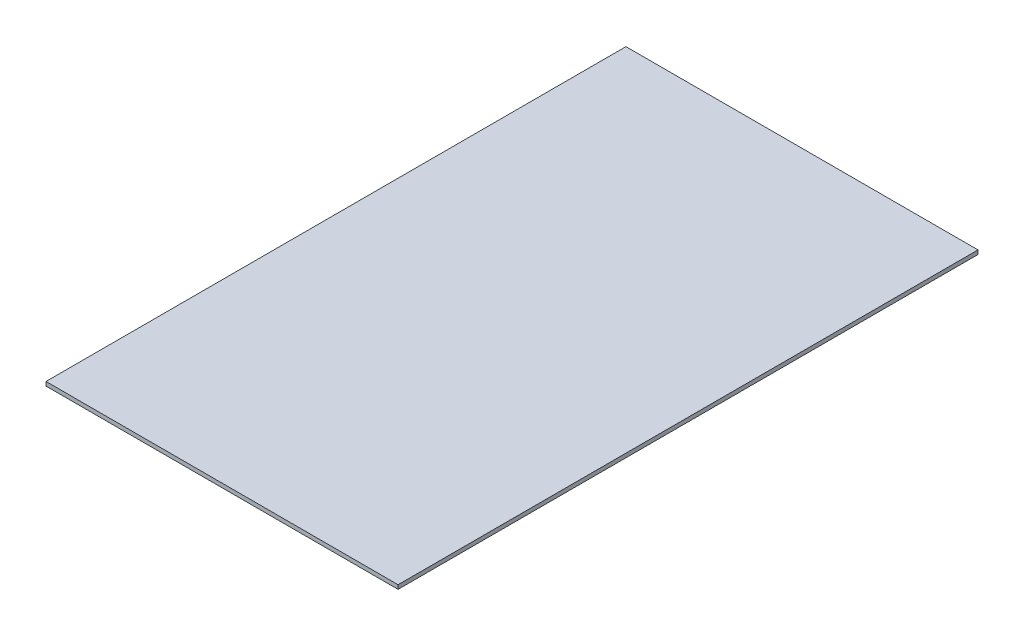
ISO-10303-21;
HEADER;
FILE_DESCRIPTION(('STEP AP214'),'2;1');
FILE_NAME('part.step','',(''),(''),'','','');
FILE_SCHEMA(('AUTOMOTIVE_DESIGN { 1 0 10303 214 1 1 1 1 }'));
ENDSEC;
DATA;
#1=APPLICATION_CONTEXT('core data for automotive mechanical design processes');
#2=APPLICATION_PROTOCOL_DEFINITION('international standard','automotive_design',2000,#1);
#3=PRODUCT_CONTEXT('',#1,'mechanical');
#4=PRODUCT('Part','Part','',(#3));
#5=PRODUCT_RELATED_PRODUCT_CATEGORY('part','',(#4));
#6=PRODUCT_DEFINITION_FORMATION('','',#4);
#7=PRODUCT_DEFINITION_CONTEXT('part definition',#1,'design');
#8=PRODUCT_DEFINITION('design','',#6,#7);
#9=PRODUCT_DEFINITION_SHAPE('','',#8);
#10=(LENGTH_UNIT() NAMED_UNIT(*) SI_UNIT(.MILLI.,.METRE.));
#11=(NAMED_UNIT(*) PLANE_ANGLE_UNIT() SI_UNIT($,.RADIAN.));
#12=(NAMED_UNIT(*) SI_UNIT($,.STERADIAN.) SOLID_ANGLE_UNIT());
#13=UNCERTAINTY_MEASURE_WITH_UNIT(LENGTH_MEASURE(1.E-05),#10,'distance_accuracy_value','');
#14=(GEOMETRIC_REPRESENTATION_CONTEXT(3) GLOBAL_UNCERTAINTY_ASSIGNED_CONTEXT((#13)) GLOBAL_UNIT_ASSIGNED_CONTEXT((#10,
#11,#12)) REPRESENTATION_CONTEXT('',''));
#15=CARTESIAN_POINT('',(0.,0.,0.));
#16=DIRECTION('',(0.,0.,1.));
#17=DIRECTION('',(1.,0.,0.));
#18=AXIS2_PLACEMENT_3D('',#15,#16,#17);
#19=CARTESIAN_POINT('',(-138.77671,1.5875,457.2));
#20=DIRECTION('',(1.,0.,0.));
#21=DIRECTION('',(0.,0.,-1.));
#22=AXIS2_PLACEMENT_3D('',#19,#20,#21);
#23=PLANE('',#22);
#24=DIRECTION('',(0.,-1.,0.));
#25=VECTOR('',#24,1.);
#26=CARTESIAN_POINT('',(-138.77671,1.5875,0.));
#27=LINE('',#26,#25);
#28=CARTESIAN_POINT('',(-138.77671,1.5875,0.));
#29=VERTEX_POINT('',#28);
#30=CARTESIAN_POINT('',(-138.77671,-1.5875,0.));
#31=VERTEX_POINT('',#30);
#32=EDGE_CURVE('E96',#29,#31,#27,.T.);
#33=ORIENTED_EDGE('',*,*,#32,.T.);
#34=DIRECTION('',(0.,0.,-1.));
#35=VECTOR('',#34,1.);
#36=CARTESIAN_POINT('',(-138.77671,-1.5875,457.2));
#37=LINE('',#36,#35);
#38=CARTESIAN_POINT('',(-138.77671,-1.5875,457.2));
#39=VERTEX_POINT('',#38);
#40=EDGE_CURVE('E11',#39,#31,#37,.T.);
#41=ORIENTED_EDGE('',*,*,#40,.F.);
#42=DIRECTION('',(0.,-1.,0.));
#43=VECTOR('',#42,1.);
#44=CARTESIAN_POINT('',(-138.77671,1.5875,457.2));
#45=LINE('',#44,#43);
#46=CARTESIAN_POINT('',(-138.77671,1.5875,457.2));
#47=VERTEX_POINT('',#46);
#48=EDGE_CURVE('E82',#47,#39,#45,.T.);
#49=ORIENTED_EDGE('',*,*,#48,.F.);
#50=DIRECTION('',(0.,0.,-1.));
#51=VECTOR('',#50,1.);
#52=CARTESIAN_POINT('',(-138.77671,1.5875,457.2));
#53=LINE('',#52,#51);
#54=EDGE_CURVE('E49',#47,#29,#53,.T.);
#55=ORIENTED_EDGE('',*,*,#54,.T.);
#56=EDGE_LOOP('',(#33,#41,#49,#55));
#57=FACE_BOUND('',#56,.T.);
#58=ADVANCED_FACE('F33',(#57),#23,.F.);
#59=CARTESIAN_POINT('',(-138.77671,-1.5875,457.2));
#60=DIRECTION('',(0.,1.,0.));
#61=DIRECTION('',(0.,0.,1.));
#62=AXIS2_PLACEMENT_3D('',#59,#60,#61);
#63=PLANE('',#62);
#64=DIRECTION('',(1.,0.,0.));
#65=VECTOR('',#64,1.);
#66=CARTESIAN_POINT('',(-138.77671,-1.5875,0.));
#67=LINE('',#66,#65);
#68=CARTESIAN_POINT('',(138.77671,-1.5875,0.));
#69=VERTEX_POINT('',#68);
#70=EDGE_CURVE('E87',#31,#69,#67,.T.);
#71=ORIENTED_EDGE('',*,*,#70,.T.);
#72=DIRECTION('',(0.,0.,-1.));
#73=VECTOR('',#72,1.);
#74=CARTESIAN_POINT('',(138.77671,-1.5875,457.2));
#75=LINE('',#74,#73);
#76=CARTESIAN_POINT('',(138.77671,-1.5875,457.2));
#77=VERTEX_POINT('',#76);
#78=EDGE_CURVE('E41',#77,#69,#75,.T.);
#79=ORIENTED_EDGE('',*,*,#78,.F.);
#80=DIRECTION('',(1.,0.,0.));
#81=VECTOR('',#80,1.);
#82=CARTESIAN_POINT('',(-138.77671,-1.5875,457.2));
#83=LINE('',#82,#81);
#84=EDGE_CURVE('E74',#39,#77,#83,.T.);
#85=ORIENTED_EDGE('',*,*,#84,.F.);
#86=ORIENTED_EDGE('',*,*,#40,.T.);
#87=EDGE_LOOP('',(#71,#79,#85,#86));
#88=FACE_BOUND('',#87,.T.);
#89=ADVANCED_FACE('F86',(#88),#63,.F.);
#90=CARTESIAN_POINT('',(138.77671,1.5875,457.2));
#91=DIRECTION('',(1.,0.,0.));
#92=DIRECTION('',(0.,0.,-1.));
#93=AXIS2_PLACEMENT_3D('',#90,#91,#92);
#94=PLANE('',#93);
#95=DIRECTION('',(0.,-1.,0.));
#96=VECTOR('',#95,1.);
#97=CARTESIAN_POINT('',(138.77671,1.5875,0.));
#98=LINE('',#97,#96);
#99=CARTESIAN_POINT('',(138.77671,1.5875,0.));
#100=VERTEX_POINT('',#99);
#101=EDGE_CURVE('E99',#100,#69,#98,.T.);
#102=ORIENTED_EDGE('',*,*,#101,.F.);
#103=DIRECTION('',(0.,0.,-1.));
#104=VECTOR('',#103,1.);
#105=CARTESIAN_POINT('',(138.77671,1.5875,457.2));
#106=LINE('',#105,#104);
#107=CARTESIAN_POINT('',(138.77671,1.5875,457.2));
#108=VERTEX_POINT('',#107);
#109=EDGE_CURVE('E63',#108,#100,#106,.T.);
#110=ORIENTED_EDGE('',*,*,#109,.F.);
#111=DIRECTION('',(0.,-1.,0.));
#112=VECTOR('',#111,1.);
#113=CARTESIAN_POINT('',(138.77671,1.5875,457.2));
#114=LINE('',#113,#112);
#115=EDGE_CURVE('E81',#108,#77,#114,.T.);
#116=ORIENTED_EDGE('',*,*,#115,.T.);
#117=ORIENTED_EDGE('',*,*,#78,.T.);
#118=EDGE_LOOP('',(#102,#110,#116,#117));
#119=FACE_BOUND('',#118,.T.);
#120=ADVANCED_FACE('F90',(#119),#94,.T.);
#121=CARTESIAN_POINT('',(-138.77671,1.5875,457.2));
#122=DIRECTION('',(0.,1.,0.));
#123=DIRECTION('',(0.,0.,1.));
#124=AXIS2_PLACEMENT_3D('',#121,#122,#123);
#125=PLANE('',#124);
#126=DIRECTION('',(1.,0.,0.));
#127=VECTOR('',#126,1.);
#128=CARTESIAN_POINT('',(-138.77671,1.5875,0.));
#129=LINE('',#128,#127);
#130=EDGE_CURVE('E101',#29,#100,#129,.T.);
#131=ORIENTED_EDGE('',*,*,#130,.F.);
#132=ORIENTED_EDGE('',*,*,#54,.F.);
#133=DIRECTION('',(1.,0.,0.));
#134=VECTOR('',#133,1.);
#135=CARTESIAN_POINT('',(-138.77671,1.5875,457.2));
#136=LINE('',#135,#134);
#137=EDGE_CURVE('E91',#47,#108,#136,.T.);
#138=ORIENTED_EDGE('',*,*,#137,.T.);
#139=ORIENTED_EDGE('',*,*,#109,.T.);
#140=EDGE_LOOP('',(#131,#132,#138,#139));
#141=FACE_BOUND('',#140,.T.);
#142=ADVANCED_FACE('F107',(#141),#125,.T.);
#143=CARTESIAN_POINT('',(0.,0.,457.2));
#144=DIRECTION('',(0.,0.,1.));
#145=DIRECTION('',(1.,0.,0.));
#146=AXIS2_PLACEMENT_3D('',#143,#144,#145);
#147=PLANE('',#146);
#148=ORIENTED_EDGE('',*,*,#48,.T.);
#149=ORIENTED_EDGE('',*,*,#84,.T.);
#150=ORIENTED_EDGE('',*,*,#115,.F.);
#151=ORIENTED_EDGE('',*,*,#137,.F.);
#152=EDGE_LOOP('',(#148,#149,#150,#151));
#153=FACE_BOUND('',#152,.T.);
#154=ADVANCED_FACE('F78',(#153),#147,.T.);
#155=CARTESIAN_POINT('',(0.,0.,0.));
#156=DIRECTION('',(0.,0.,1.));
#157=DIRECTION('',(1.,0.,0.));
#158=AXIS2_PLACEMENT_3D('',#155,#156,#157);
#159=PLANE('',#158);
#160=ORIENTED_EDGE('',*,*,#32,.F.);
#161=ORIENTED_EDGE('',*,*,#130,.T.);
#162=ORIENTED_EDGE('',*,*,#101,.T.);
#163=ORIENTED_EDGE('',*,*,#70,.F.);
#164=EDGE_LOOP('',(#160,#161,#162,#163));
#165=FACE_BOUND('',#164,.T.);
#166=ADVANCED_FACE('F106',(#165),#159,.F.);
#167=CLOSED_SHELL('',(#58,#89,#120,#142,#154,#166));
#168=MANIFOLD_SOLID_BREP('B2',#167);
#169=ADVANCED_BREP_SHAPE_REPRESENTATION('',(#18,#168),#14);
#170=SHAPE_DEFINITION_REPRESENTATION(#9,#169);
ENDSEC;
END-ISO-10303-21;
